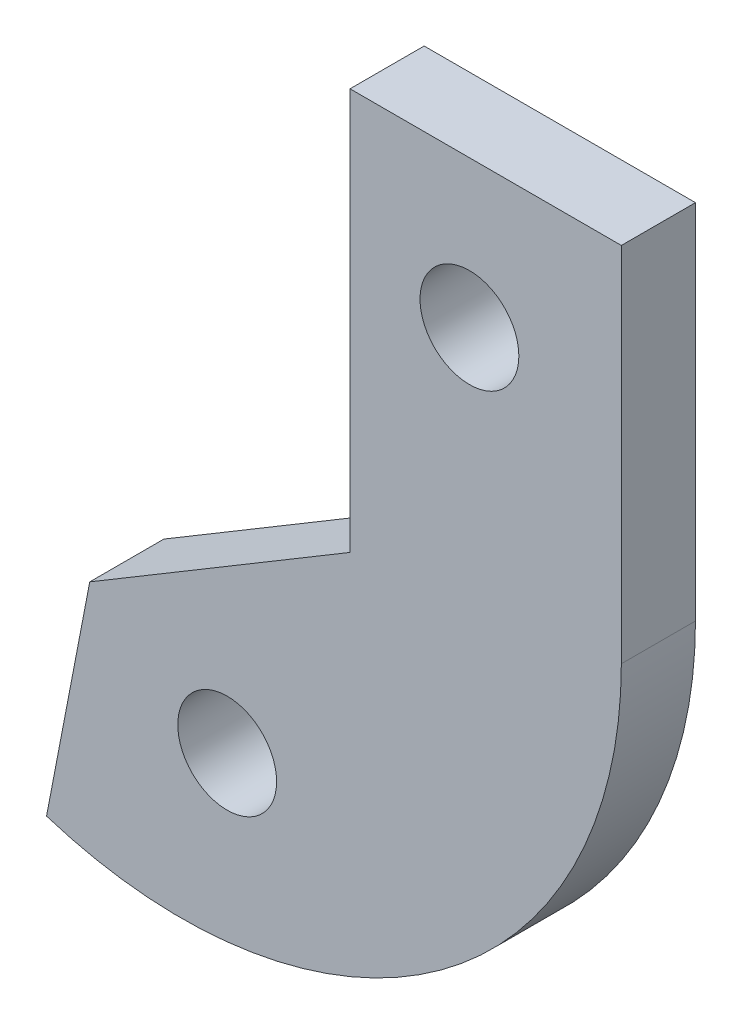
ISO-10303-21;
HEADER;
FILE_DESCRIPTION(('STEP AP214'),'2;1');
FILE_NAME('part.step','',(''),(''),'','','');
FILE_SCHEMA(('AUTOMOTIVE_DESIGN { 1 0 10303 214 1 1 1 1 }'));
ENDSEC;
DATA;
#1=APPLICATION_CONTEXT('core data for automotive mechanical design processes');
#2=APPLICATION_PROTOCOL_DEFINITION('international standard','automotive_design',2000,#1);
#3=PRODUCT_CONTEXT('',#1,'mechanical');
#4=PRODUCT('Part','Part','',(#3));
#5=PRODUCT_RELATED_PRODUCT_CATEGORY('part','',(#4));
#6=PRODUCT_DEFINITION_FORMATION('','',#4);
#7=PRODUCT_DEFINITION_CONTEXT('part definition',#1,'design');
#8=PRODUCT_DEFINITION('design','',#6,#7);
#9=PRODUCT_DEFINITION_SHAPE('','',#8);
#10=(LENGTH_UNIT() NAMED_UNIT(*) SI_UNIT(.MILLI.,.METRE.));
#11=(NAMED_UNIT(*) PLANE_ANGLE_UNIT() SI_UNIT($,.RADIAN.));
#12=(NAMED_UNIT(*) SI_UNIT($,.STERADIAN.) SOLID_ANGLE_UNIT());
#13=UNCERTAINTY_MEASURE_WITH_UNIT(LENGTH_MEASURE(1.E-05),#10,'distance_accuracy_value','');
#14=(GEOMETRIC_REPRESENTATION_CONTEXT(3) GLOBAL_UNCERTAINTY_ASSIGNED_CONTEXT((#13)) GLOBAL_UNIT_ASSIGNED_CONTEXT((#10,
#11,#12)) REPRESENTATION_CONTEXT('',''));
#15=CARTESIAN_POINT('',(0.,0.,0.));
#16=DIRECTION('',(0.,0.,1.));
#17=DIRECTION('',(1.,0.,0.));
#18=AXIS2_PLACEMENT_3D('',#15,#16,#17);
#19=CARTESIAN_POINT('',(2.17520257975725,-7.33231119350928,3.));
#20=DIRECTION('',(0.,0.,-1.));
#21=DIRECTION('',(-1.,0.,0.));
#22=AXIS2_PLACEMENT_3D('',#19,#20,#21);
#23=CYLINDRICAL_SURFACE('',#22,17.8247974202428);
#24=CARTESIAN_POINT('',(2.17520257975725,-7.33231119350928,0.));
#25=DIRECTION('',(0.,0.,1.));
#26=DIRECTION('',(1.,0.,0.));
#27=AXIS2_PLACEMENT_3D('',#24,#25,#26);
#28=CIRCLE('',#27,17.8247974202428);
#29=CARTESIAN_POINT('',(20.,-7.33231119350928,0.));
#30=VERTEX_POINT('',#29);
#31=CARTESIAN_POINT('',(-3.26719030982332,-24.3059308047806,0.));
#32=VERTEX_POINT('',#31);
#33=EDGE_CURVE('E130',#30,#32,#28,.F.);
#34=ORIENTED_EDGE('',*,*,#33,.F.);
#35=DIRECTION('',(0.,0.,-1.));
#36=VECTOR('',#35,1.);
#37=CARTESIAN_POINT('',(20.,-7.33231119350928,3.));
#38=LINE('',#37,#36);
#39=CARTESIAN_POINT('',(20.,-7.33231119350928,3.));
#40=VERTEX_POINT('',#39);
#41=EDGE_CURVE('E11',#40,#30,#38,.T.);
#42=ORIENTED_EDGE('',*,*,#41,.F.);
#43=CARTESIAN_POINT('',(2.17520257975725,-7.33231119350928,3.));
#44=DIRECTION('',(0.,0.,1.));
#45=DIRECTION('',(1.,0.,0.));
#46=AXIS2_PLACEMENT_3D('',#43,#44,#45);
#47=CIRCLE('',#46,17.8247974202428);
#48=CARTESIAN_POINT('',(-3.26719030982332,-24.3059308047806,3.));
#49=VERTEX_POINT('',#48);
#50=EDGE_CURVE('E190',#40,#49,#47,.F.);
#51=ORIENTED_EDGE('',*,*,#50,.T.);
#52=DIRECTION('',(0.,0.,-1.));
#53=VECTOR('',#52,1.);
#54=CARTESIAN_POINT('',(-3.26719030982332,-24.3059308047806,3.));
#55=LINE('',#54,#53);
#56=EDGE_CURVE('E83',#49,#32,#55,.T.);
#57=ORIENTED_EDGE('',*,*,#56,.T.);
#58=EDGE_LOOP('',(#34,#42,#51,#57));
#59=FACE_BOUND('',#58,.T.);
#60=ADVANCED_FACE('F37',(#59),#23,.T.);
#61=CARTESIAN_POINT('',(20.,0.,3.));
#62=DIRECTION('',(-1.,0.,0.));
#63=DIRECTION('',(0.,0.,1.));
#64=AXIS2_PLACEMENT_3D('',#61,#62,#63);
#65=PLANE('',#64);
#66=DIRECTION('',(0.,1.,0.));
#67=VECTOR('',#66,1.);
#68=CARTESIAN_POINT('',(20.,0.,0.));
#69=LINE('',#68,#67);
#70=CARTESIAN_POINT('',(20.,7.33231119350927,0.));
#71=VERTEX_POINT('',#70);
#72=EDGE_CURVE('E132',#30,#71,#69,.T.);
#73=ORIENTED_EDGE('',*,*,#72,.T.);
#74=DIRECTION('',(0.,0.,-1.));
#75=VECTOR('',#74,1.);
#76=CARTESIAN_POINT('',(20.,7.33231119350927,3.));
#77=LINE('',#76,#75);
#78=CARTESIAN_POINT('',(20.,7.33231119350927,3.));
#79=VERTEX_POINT('',#78);
#80=EDGE_CURVE('E46',#79,#71,#77,.T.);
#81=ORIENTED_EDGE('',*,*,#80,.F.);
#82=DIRECTION('',(0.,1.,0.));
#83=VECTOR('',#82,1.);
#84=CARTESIAN_POINT('',(20.,0.,3.));
#85=LINE('',#84,#83);
#86=EDGE_CURVE('E119',#40,#79,#85,.T.);
#87=ORIENTED_EDGE('',*,*,#86,.F.);
#88=ORIENTED_EDGE('',*,*,#41,.T.);
#89=EDGE_LOOP('',(#73,#81,#87,#88));
#90=FACE_BOUND('',#89,.T.);
#91=ADVANCED_FACE('F154',(#90),#65,.F.);
#92=CARTESIAN_POINT('',(0.,7.33231119350929,3.));
#93=DIRECTION('',(0.,1.,0.));
#94=DIRECTION('',(-1.,0.,0.));
#95=AXIS2_PLACEMENT_3D('',#92,#93,#94);
#96=PLANE('',#95);
#97=DIRECTION('',(1.,0.,0.));
#98=VECTOR('',#97,1.);
#99=CARTESIAN_POINT('',(0.,7.33231119350929,0.));
#100=LINE('',#99,#98);
#101=CARTESIAN_POINT('',(9.01795072137288,7.33231119350928,0.));
#102=VERTEX_POINT('',#101);
#103=EDGE_CURVE('E135',#102,#71,#100,.T.);
#104=ORIENTED_EDGE('',*,*,#103,.F.);
#105=DIRECTION('',(0.,0.,-1.));
#106=VECTOR('',#105,1.);
#107=CARTESIAN_POINT('',(9.01795072137288,7.33231119350928,3.));
#108=LINE('',#107,#106);
#109=CARTESIAN_POINT('',(9.01795072137288,7.33231119350928,3.));
#110=VERTEX_POINT('',#109);
#111=EDGE_CURVE('E106',#110,#102,#108,.T.);
#112=ORIENTED_EDGE('',*,*,#111,.F.);
#113=DIRECTION('',(1.,0.,0.));
#114=VECTOR('',#113,1.);
#115=CARTESIAN_POINT('',(0.,7.33231119350929,3.));
#116=LINE('',#115,#114);
#117=EDGE_CURVE('E117',#110,#79,#116,.T.);
#118=ORIENTED_EDGE('',*,*,#117,.T.);
#119=ORIENTED_EDGE('',*,*,#80,.T.);
#120=EDGE_LOOP('',(#104,#112,#118,#119));
#121=FACE_BOUND('',#120,.T.);
#122=ADVANCED_FACE('F151',(#121),#96,.T.);
#123=CARTESIAN_POINT('',(9.01795072137288,0.,3.));
#124=DIRECTION('',(-1.,0.,0.));
#125=DIRECTION('',(0.,0.,1.));
#126=AXIS2_PLACEMENT_3D('',#123,#124,#125);
#127=PLANE('',#126);
#128=DIRECTION('',(0.,1.,0.));
#129=VECTOR('',#128,1.);
#130=CARTESIAN_POINT('',(9.01795072137288,0.,0.));
#131=LINE('',#130,#129);
#132=CARTESIAN_POINT('',(9.01795072137288,-8.92022135673202,0.));
#133=VERTEX_POINT('',#132);
#134=EDGE_CURVE('E103',#133,#102,#131,.T.);
#135=ORIENTED_EDGE('',*,*,#134,.F.);
#136=DIRECTION('',(0.,0.,-1.));
#137=VECTOR('',#136,1.);
#138=CARTESIAN_POINT('',(9.01795072137288,-8.92022135673202,3.));
#139=LINE('',#138,#137);
#140=CARTESIAN_POINT('',(9.01795072137288,-8.92022135673202,3.));
#141=VERTEX_POINT('',#140);
#142=EDGE_CURVE('E97',#141,#133,#139,.T.);
#143=ORIENTED_EDGE('',*,*,#142,.F.);
#144=DIRECTION('',(0.,1.,0.));
#145=VECTOR('',#144,1.);
#146=CARTESIAN_POINT('',(9.01795072137288,0.,3.));
#147=LINE('',#146,#145);
#148=EDGE_CURVE('E101',#141,#110,#147,.T.);
#149=ORIENTED_EDGE('',*,*,#148,.T.);
#150=ORIENTED_EDGE('',*,*,#111,.T.);
#151=EDGE_LOOP('',(#135,#143,#149,#150));
#152=FACE_BOUND('',#151,.T.);
#153=ADVANCED_FACE('F99',(#152),#127,.T.);
#154=CARTESIAN_POINT('',(6.30415890315605,-10.5429358538415,3.));
#155=DIRECTION('',(0.513202081021955,-0.858267804379691,0.));
#156=DIRECTION('',(0.858267804379691,0.513202081021955,0.));
#157=AXIS2_PLACEMENT_3D('',#154,#155,#156);
#158=PLANE('',#157);
#159=DIRECTION('',(-0.858267804379691,-0.513202081021955,0.));
#160=VECTOR('',#159,1.);
#161=CARTESIAN_POINT('',(6.30415890315605,-10.5429358538415,0.));
#162=LINE('',#161,#160);
#163=CARTESIAN_POINT('',(-1.51835224474241,-15.2204141181234,0.));
#164=VERTEX_POINT('',#163);
#165=EDGE_CURVE('E139',#133,#164,#162,.T.);
#166=ORIENTED_EDGE('',*,*,#165,.T.);
#167=DIRECTION('',(0.,0.,-1.));
#168=VECTOR('',#167,1.);
#169=CARTESIAN_POINT('',(-1.51835224474241,-15.2204141181234,3.));
#170=LINE('',#169,#168);
#171=CARTESIAN_POINT('',(-1.51835224474241,-15.2204141181234,3.));
#172=VERTEX_POINT('',#171);
#173=EDGE_CURVE('E107',#172,#164,#170,.T.);
#174=ORIENTED_EDGE('',*,*,#173,.F.);
#175=DIRECTION('',(-0.858267804379691,-0.513202081021955,0.));
#176=VECTOR('',#175,1.);
#177=CARTESIAN_POINT('',(6.30415890315605,-10.5429358538415,3.));
#178=LINE('',#177,#176);
#179=EDGE_CURVE('E110',#141,#172,#178,.T.);
#180=ORIENTED_EDGE('',*,*,#179,.F.);
#181=ORIENTED_EDGE('',*,*,#142,.T.);
#182=EDGE_LOOP('',(#166,#174,#180,#181));
#183=FACE_BOUND('',#182,.T.);
#184=ADVANCED_FACE('F111',(#183),#158,.F.);
#185=CARTESIAN_POINT('',(1.36094552309461,-0.261963454294747,3.));
#186=DIRECTION('',(0.981973895281685,-0.189016583889652,0.));
#187=DIRECTION('',(0.189016583889652,0.981973895281685,0.));
#188=AXIS2_PLACEMENT_3D('',#185,#186,#187);
#189=PLANE('',#188);
#190=DIRECTION('',(-0.189016583889652,-0.981973895281685,0.));
#191=VECTOR('',#190,1.);
#192=CARTESIAN_POINT('',(1.36094552309461,-0.261963454294747,0.));
#193=LINE('',#192,#191);
#194=EDGE_CURVE('E76',#164,#32,#193,.T.);
#195=ORIENTED_EDGE('',*,*,#194,.T.);
#196=ORIENTED_EDGE('',*,*,#56,.F.);
#197=DIRECTION('',(-0.189016583889652,-0.981973895281685,0.));
#198=VECTOR('',#197,1.);
#199=CARTESIAN_POINT('',(1.36094552309461,-0.261963454294747,3.));
#200=LINE('',#199,#198);
#201=EDGE_CURVE('E54',#172,#49,#200,.T.);
#202=ORIENTED_EDGE('',*,*,#201,.F.);
#203=ORIENTED_EDGE('',*,*,#173,.T.);
#204=EDGE_LOOP('',(#195,#196,#202,#203));
#205=FACE_BOUND('',#204,.T.);
#206=ADVANCED_FACE('F172',(#205),#189,.F.);
#207=CARTESIAN_POINT('',(4.04532645237533,-18.4434255377461,3.));
#208=DIRECTION('',(0.,0.,-1.));
#209=DIRECTION('',(-1.,0.,0.));
#210=AXIS2_PLACEMENT_3D('',#207,#208,#209);
#211=CYLINDRICAL_SURFACE('',#210,2.);
#212=CARTESIAN_POINT('',(4.04532645237533,-18.4434255377461,3.));
#213=DIRECTION('',(0.,0.,1.));
#214=DIRECTION('',(1.,0.,0.));
#215=AXIS2_PLACEMENT_3D('',#212,#213,#214);
#216=CIRCLE('',#215,2.);
#217=CARTESIAN_POINT('',(6.04532645237534,-18.4434255377461,3.));
#218=VERTEX_POINT('',#217);
#219=EDGE_CURVE('E145',#218,#218,#216,.T.);
#220=ORIENTED_EDGE('',*,*,#219,.T.);
#221=EDGE_LOOP('',(#220));
#222=FACE_BOUND('',#221,.T.);
#223=CARTESIAN_POINT('',(4.04532645237533,-18.4434255377461,0.));
#224=DIRECTION('',(0.,0.,1.));
#225=DIRECTION('',(1.,0.,0.));
#226=AXIS2_PLACEMENT_3D('',#223,#224,#225);
#227=CIRCLE('',#226,2.);
#228=CARTESIAN_POINT('',(6.04532645237534,-18.4434255377461,0.));
#229=VERTEX_POINT('',#228);
#230=EDGE_CURVE('E127',#229,#229,#227,.T.);
#231=ORIENTED_EDGE('',*,*,#230,.F.);
#232=EDGE_LOOP('',(#231));
#233=FACE_BOUND('',#232,.T.);
#234=ADVANCED_FACE('F39',(#222,#233),#211,.F.);
#235=CARTESIAN_POINT('',(13.8510365706695,1.37921930106953,3.));
#236=DIRECTION('',(0.,0.,-1.));
#237=DIRECTION('',(-1.,0.,0.));
#238=AXIS2_PLACEMENT_3D('',#235,#236,#237);
#239=CYLINDRICAL_SURFACE('',#238,2.);
#240=CARTESIAN_POINT('',(13.8510365706695,1.37921930106953,3.));
#241=DIRECTION('',(0.,0.,1.));
#242=DIRECTION('',(1.,0.,0.));
#243=AXIS2_PLACEMENT_3D('',#240,#241,#242);
#244=CIRCLE('',#243,2.);
#245=CARTESIAN_POINT('',(15.8510365706695,1.37921930106953,3.));
#246=VERTEX_POINT('',#245);
#247=EDGE_CURVE('E124',#246,#246,#244,.T.);
#248=ORIENTED_EDGE('',*,*,#247,.T.);
#249=EDGE_LOOP('',(#248));
#250=FACE_BOUND('',#249,.T.);
#251=CARTESIAN_POINT('',(13.8510365706695,1.37921930106953,0.));
#252=DIRECTION('',(0.,0.,1.));
#253=DIRECTION('',(1.,0.,0.));
#254=AXIS2_PLACEMENT_3D('',#251,#252,#253);
#255=CIRCLE('',#254,2.);
#256=CARTESIAN_POINT('',(15.8510365706695,1.37921930106953,0.));
#257=VERTEX_POINT('',#256);
#258=EDGE_CURVE('E142',#257,#257,#255,.T.);
#259=ORIENTED_EDGE('',*,*,#258,.F.);
#260=EDGE_LOOP('',(#259));
#261=FACE_BOUND('',#260,.T.);
#262=ADVANCED_FACE('F162',(#250,#261),#239,.F.);
#263=CARTESIAN_POINT('',(0.,0.,3.));
#264=DIRECTION('',(0.,0.,1.));
#265=DIRECTION('',(1.,0.,0.));
#266=AXIS2_PLACEMENT_3D('',#263,#264,#265);
#267=PLANE('',#266);
#268=ORIENTED_EDGE('',*,*,#219,.F.);
#269=EDGE_LOOP('',(#268));
#270=FACE_BOUND('',#269,.T.);
#271=ORIENTED_EDGE('',*,*,#50,.F.);
#272=ORIENTED_EDGE('',*,*,#86,.T.);
#273=ORIENTED_EDGE('',*,*,#117,.F.);
#274=ORIENTED_EDGE('',*,*,#148,.F.);
#275=ORIENTED_EDGE('',*,*,#179,.T.);
#276=ORIENTED_EDGE('',*,*,#201,.T.);
#277=EDGE_LOOP('',(#271,#272,#273,#274,#275,#276));
#278=FACE_BOUND('',#277,.T.);
#279=ORIENTED_EDGE('',*,*,#247,.F.);
#280=EDGE_LOOP('',(#279));
#281=FACE_BOUND('',#280,.T.);
#282=ADVANCED_FACE('F114',(#270,#278,#281),#267,.T.);
#283=CARTESIAN_POINT('',(0.,0.,0.));
#284=DIRECTION('',(0.,0.,1.));
#285=DIRECTION('',(1.,0.,0.));
#286=AXIS2_PLACEMENT_3D('',#283,#284,#285);
#287=PLANE('',#286);
#288=ORIENTED_EDGE('',*,*,#230,.T.);
#289=EDGE_LOOP('',(#288));
#290=FACE_BOUND('',#289,.T.);
#291=ORIENTED_EDGE('',*,*,#33,.T.);
#292=ORIENTED_EDGE('',*,*,#194,.F.);
#293=ORIENTED_EDGE('',*,*,#165,.F.);
#294=ORIENTED_EDGE('',*,*,#134,.T.);
#295=ORIENTED_EDGE('',*,*,#103,.T.);
#296=ORIENTED_EDGE('',*,*,#72,.F.);
#297=EDGE_LOOP('',(#291,#292,#293,#294,#295,#296));
#298=FACE_BOUND('',#297,.T.);
#299=ORIENTED_EDGE('',*,*,#258,.T.);
#300=EDGE_LOOP('',(#299));
#301=FACE_BOUND('',#300,.T.);
#302=ADVANCED_FACE('F155',(#290,#298,#301),#287,.F.);
#303=CLOSED_SHELL('',(#60,#91,#122,#153,#184,#206,#234,#262,#282,#302));
#304=MANIFOLD_SOLID_BREP('B2',#303);
#305=ADVANCED_BREP_SHAPE_REPRESENTATION('',(#18,#304),#14);
#306=SHAPE_DEFINITION_REPRESENTATION(#9,#305);
ENDSEC;
END-ISO-10303-21;
